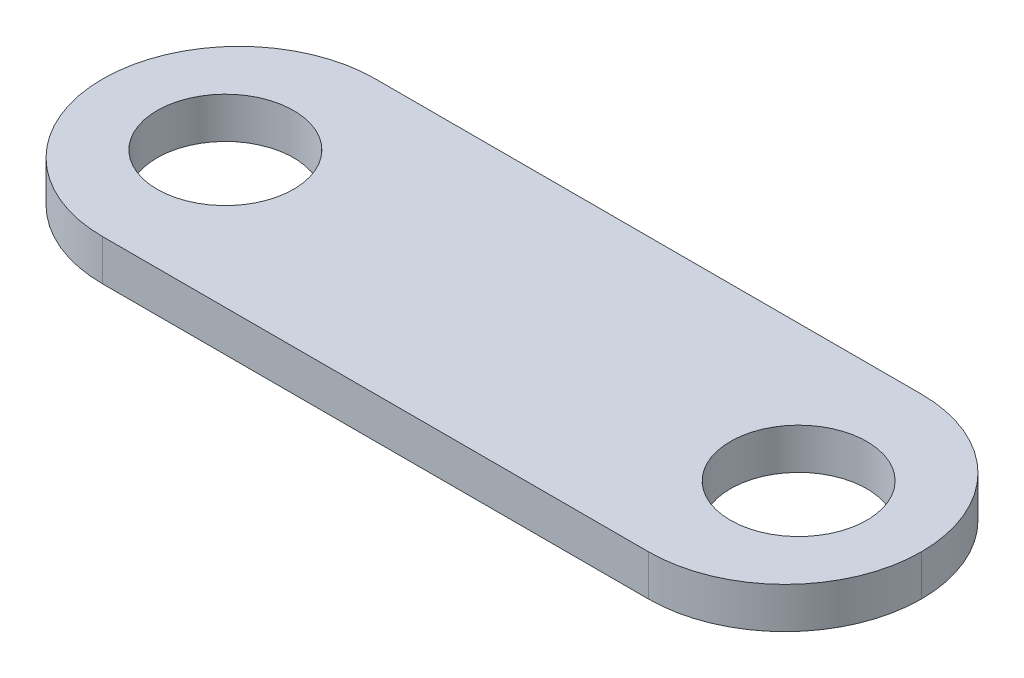
ISO-10303-21;
HEADER;
FILE_DESCRIPTION(('STEP AP214'),'2;1');
FILE_NAME('part.step','',(''),(''),'','','');
FILE_SCHEMA(('AUTOMOTIVE_DESIGN { 1 0 10303 214 1 1 1 1 }'));
ENDSEC;
DATA;
#1=APPLICATION_CONTEXT('core data for automotive mechanical design processes');
#2=APPLICATION_PROTOCOL_DEFINITION('international standard','automotive_design',2000,#1);
#3=PRODUCT_CONTEXT('',#1,'mechanical');
#4=PRODUCT('Part','Part','',(#3));
#5=PRODUCT_RELATED_PRODUCT_CATEGORY('part','',(#4));
#6=PRODUCT_DEFINITION_FORMATION('','',#4);
#7=PRODUCT_DEFINITION_CONTEXT('part definition',#1,'design');
#8=PRODUCT_DEFINITION('design','',#6,#7);
#9=PRODUCT_DEFINITION_SHAPE('','',#8);
#10=(LENGTH_UNIT() NAMED_UNIT(*) SI_UNIT(.MILLI.,.METRE.));
#11=(NAMED_UNIT(*) PLANE_ANGLE_UNIT() SI_UNIT($,.RADIAN.));
#12=(NAMED_UNIT(*) SI_UNIT($,.STERADIAN.) SOLID_ANGLE_UNIT());
#13=UNCERTAINTY_MEASURE_WITH_UNIT(LENGTH_MEASURE(1.E-05),#10,'distance_accuracy_value','');
#14=(GEOMETRIC_REPRESENTATION_CONTEXT(3) GLOBAL_UNCERTAINTY_ASSIGNED_CONTEXT((#13)) GLOBAL_UNIT_ASSIGNED_CONTEXT((#10,
#11,#12)) REPRESENTATION_CONTEXT('',''));
#15=CARTESIAN_POINT('',(0.,0.,0.));
#16=DIRECTION('',(0.,0.,1.));
#17=DIRECTION('',(1.,0.,0.));
#18=AXIS2_PLACEMENT_3D('',#15,#16,#17);
#19=CARTESIAN_POINT('',(0.,3.,0.));
#20=DIRECTION('',(0.,0.,-1.));
#21=DIRECTION('',(-1.,0.,0.));
#22=AXIS2_PLACEMENT_3D('',#19,#20,#21);
#23=PLANE('',#22);
#24=DIRECTION('',(1.,0.,0.));
#25=VECTOR('',#24,1.);
#26=CARTESIAN_POINT('',(0.,0.,0.));
#27=LINE('',#26,#25);
#28=CARTESIAN_POINT('',(10.,0.,0.));
#29=VERTEX_POINT('',#28);
#30=CARTESIAN_POINT('',(50.,0.,0.));
#31=VERTEX_POINT('',#30);
#32=EDGE_CURVE('E99',#29,#31,#27,.T.);
#33=ORIENTED_EDGE('',*,*,#32,.T.);
#34=DIRECTION('',(0.,-1.,0.));
#35=VECTOR('',#34,1.);
#36=CARTESIAN_POINT('',(50.,3.,0.));
#37=LINE('',#36,#35);
#38=CARTESIAN_POINT('',(50.,3.,0.));
#39=VERTEX_POINT('',#38);
#40=EDGE_CURVE('E11',#31,#39,#37,.F.);
#41=ORIENTED_EDGE('',*,*,#40,.T.);
#42=DIRECTION('',(1.,0.,0.));
#43=VECTOR('',#42,1.);
#44=CARTESIAN_POINT('',(0.,3.,0.));
#45=LINE('',#44,#43);
#46=CARTESIAN_POINT('',(10.,3.,0.));
#47=VERTEX_POINT('',#46);
#48=EDGE_CURVE('E141',#47,#39,#45,.T.);
#49=ORIENTED_EDGE('',*,*,#48,.F.);
#50=DIRECTION('',(0.,-1.,0.));
#51=VECTOR('',#50,1.);
#52=CARTESIAN_POINT('',(10.,3.,0.));
#53=LINE('',#52,#51);
#54=EDGE_CURVE('E123',#47,#29,#53,.T.);
#55=ORIENTED_EDGE('',*,*,#54,.T.);
#56=EDGE_LOOP('',(#33,#41,#49,#55));
#57=FACE_BOUND('',#56,.T.);
#58=ADVANCED_FACE('F37',(#57),#23,.F.);
#59=CARTESIAN_POINT('',(0.,3.,-20.));
#60=DIRECTION('',(0.,0.,1.));
#61=DIRECTION('',(1.,0.,0.));
#62=AXIS2_PLACEMENT_3D('',#59,#60,#61);
#63=PLANE('',#62);
#64=DIRECTION('',(-1.,0.,0.));
#65=VECTOR('',#64,1.);
#66=CARTESIAN_POINT('',(0.,3.,-20.));
#67=LINE('',#66,#65);
#68=CARTESIAN_POINT('',(50.,3.,-20.));
#69=VERTEX_POINT('',#68);
#70=CARTESIAN_POINT('',(10.,3.,-20.));
#71=VERTEX_POINT('',#70);
#72=EDGE_CURVE('E102',#69,#71,#67,.T.);
#73=ORIENTED_EDGE('',*,*,#72,.F.);
#74=DIRECTION('',(0.,-1.,0.));
#75=VECTOR('',#74,1.);
#76=CARTESIAN_POINT('',(50.,3.,-20.));
#77=LINE('',#76,#75);
#78=CARTESIAN_POINT('',(50.,0.,-20.));
#79=VERTEX_POINT('',#78);
#80=EDGE_CURVE('E124',#69,#79,#77,.T.);
#81=ORIENTED_EDGE('',*,*,#80,.T.);
#82=DIRECTION('',(-1.,0.,0.));
#83=VECTOR('',#82,1.);
#84=CARTESIAN_POINT('',(0.,0.,-20.));
#85=LINE('',#84,#83);
#86=CARTESIAN_POINT('',(10.,0.,-20.));
#87=VERTEX_POINT('',#86);
#88=EDGE_CURVE('E145',#79,#87,#85,.T.);
#89=ORIENTED_EDGE('',*,*,#88,.T.);
#90=DIRECTION('',(0.,-1.,0.));
#91=VECTOR('',#90,1.);
#92=CARTESIAN_POINT('',(10.,3.,-20.));
#93=LINE('',#92,#91);
#94=EDGE_CURVE('E115',#87,#71,#93,.F.);
#95=ORIENTED_EDGE('',*,*,#94,.T.);
#96=EDGE_LOOP('',(#73,#81,#89,#95));
#97=FACE_BOUND('',#96,.T.);
#98=ADVANCED_FACE('F140',(#97),#63,.F.);
#99=CARTESIAN_POINT('',(0.,3.,0.));
#100=DIRECTION('',(0.,-1.,0.));
#101=DIRECTION('',(0.,0.,-1.));
#102=AXIS2_PLACEMENT_3D('',#99,#100,#101);
#103=PLANE('',#102);
#104=CARTESIAN_POINT('',(51.,3.,-10.));
#105=DIRECTION('',(0.,1.,0.));
#106=DIRECTION('',(0.,0.,1.));
#107=AXIS2_PLACEMENT_3D('',#104,#105,#106);
#108=CIRCLE('',#107,4.99999999999999);
#109=CARTESIAN_POINT('',(51.,3.,-5.00000000000001));
#110=VERTEX_POINT('',#109);
#111=EDGE_CURVE('E111',#110,#110,#108,.T.);
#112=ORIENTED_EDGE('',*,*,#111,.F.);
#113=EDGE_LOOP('',(#112));
#114=FACE_BOUND('',#113,.T.);
#115=CARTESIAN_POINT('',(9.,3.,-10.));
#116=DIRECTION('',(0.,1.,0.));
#117=DIRECTION('',(0.,0.,1.));
#118=AXIS2_PLACEMENT_3D('',#115,#116,#117);
#119=CIRCLE('',#118,5.);
#120=CARTESIAN_POINT('',(9.,3.,-5.));
#121=VERTEX_POINT('',#120);
#122=EDGE_CURVE('E189',#121,#121,#119,.T.);
#123=ORIENTED_EDGE('',*,*,#122,.F.);
#124=EDGE_LOOP('',(#123));
#125=FACE_BOUND('',#124,.T.);
#126=CARTESIAN_POINT('',(50.,3.,-10.));
#127=DIRECTION('',(0.,-1.,0.));
#128=DIRECTION('',(0.,0.,-1.));
#129=AXIS2_PLACEMENT_3D('',#126,#127,#128);
#130=CIRCLE('',#129,10.);
#131=CARTESIAN_POINT('',(60.,3.,-10.));
#132=VERTEX_POINT('',#131);
#133=EDGE_CURVE('E53',#39,#132,#130,.F.);
#134=ORIENTED_EDGE('',*,*,#133,.T.);
#135=CARTESIAN_POINT('',(50.,3.,-10.));
#136=DIRECTION('',(0.,-1.,0.));
#137=DIRECTION('',(0.,0.,-1.));
#138=AXIS2_PLACEMENT_3D('',#135,#136,#137);
#139=CIRCLE('',#138,10.);
#140=EDGE_CURVE('E46',#132,#69,#139,.F.);
#141=ORIENTED_EDGE('',*,*,#140,.T.);
#142=ORIENTED_EDGE('',*,*,#72,.T.);
#143=CARTESIAN_POINT('',(10.,3.,-10.));
#144=DIRECTION('',(0.,-1.,0.));
#145=DIRECTION('',(0.,0.,-1.));
#146=AXIS2_PLACEMENT_3D('',#143,#144,#145);
#147=CIRCLE('',#146,10.);
#148=CARTESIAN_POINT('',(0.,3.,-10.));
#149=VERTEX_POINT('',#148);
#150=EDGE_CURVE('E121',#71,#149,#147,.F.);
#151=ORIENTED_EDGE('',*,*,#150,.T.);
#152=CARTESIAN_POINT('',(10.,3.,-10.));
#153=DIRECTION('',(0.,-1.,0.));
#154=DIRECTION('',(0.,0.,-1.));
#155=AXIS2_PLACEMENT_3D('',#152,#153,#154);
#156=CIRCLE('',#155,10.);
#157=EDGE_CURVE('E108',#149,#47,#156,.F.);
#158=ORIENTED_EDGE('',*,*,#157,.T.);
#159=ORIENTED_EDGE('',*,*,#48,.T.);
#160=EDGE_LOOP('',(#134,#141,#142,#151,#158,#159));
#161=FACE_BOUND('',#160,.T.);
#162=ADVANCED_FACE('F135',(#114,#125,#161),#103,.F.);
#163=CARTESIAN_POINT('',(0.,0.,0.));
#164=DIRECTION('',(0.,-1.,0.));
#165=DIRECTION('',(0.,0.,-1.));
#166=AXIS2_PLACEMENT_3D('',#163,#164,#165);
#167=PLANE('',#166);
#168=CARTESIAN_POINT('',(51.,0.,-10.));
#169=DIRECTION('',(0.,1.,0.));
#170=DIRECTION('',(0.,0.,1.));
#171=AXIS2_PLACEMENT_3D('',#168,#169,#170);
#172=CIRCLE('',#171,4.99999999999999);
#173=CARTESIAN_POINT('',(51.,0.,-5.00000000000001));
#174=VERTEX_POINT('',#173);
#175=EDGE_CURVE('E185',#174,#174,#172,.T.);
#176=ORIENTED_EDGE('',*,*,#175,.T.);
#177=EDGE_LOOP('',(#176));
#178=FACE_BOUND('',#177,.T.);
#179=CARTESIAN_POINT('',(9.,0.,-10.));
#180=DIRECTION('',(0.,1.,0.));
#181=DIRECTION('',(0.,0.,1.));
#182=AXIS2_PLACEMENT_3D('',#179,#180,#181);
#183=CIRCLE('',#182,5.);
#184=CARTESIAN_POINT('',(9.,0.,-5.));
#185=VERTEX_POINT('',#184);
#186=EDGE_CURVE('E188',#185,#185,#183,.T.);
#187=ORIENTED_EDGE('',*,*,#186,.T.);
#188=EDGE_LOOP('',(#187));
#189=FACE_BOUND('',#188,.T.);
#190=ORIENTED_EDGE('',*,*,#88,.F.);
#191=CARTESIAN_POINT('',(50.,0.,-10.));
#192=DIRECTION('',(0.,-1.,0.));
#193=DIRECTION('',(0.,0.,-1.));
#194=AXIS2_PLACEMENT_3D('',#191,#192,#193);
#195=CIRCLE('',#194,10.);
#196=CARTESIAN_POINT('',(60.,0.,-10.));
#197=VERTEX_POINT('',#196);
#198=EDGE_CURVE('E130',#79,#197,#195,.T.);
#199=ORIENTED_EDGE('',*,*,#198,.T.);
#200=CARTESIAN_POINT('',(50.,0.,-10.));
#201=DIRECTION('',(0.,-1.,0.));
#202=DIRECTION('',(0.,0.,-1.));
#203=AXIS2_PLACEMENT_3D('',#200,#201,#202);
#204=CIRCLE('',#203,10.);
#205=EDGE_CURVE('E128',#197,#31,#204,.T.);
#206=ORIENTED_EDGE('',*,*,#205,.T.);
#207=ORIENTED_EDGE('',*,*,#32,.F.);
#208=CARTESIAN_POINT('',(10.,0.,-10.));
#209=DIRECTION('',(0.,-1.,0.));
#210=DIRECTION('',(0.,0.,-1.));
#211=AXIS2_PLACEMENT_3D('',#208,#209,#210);
#212=CIRCLE('',#211,10.);
#213=CARTESIAN_POINT('',(0.,0.,-10.));
#214=VERTEX_POINT('',#213);
#215=EDGE_CURVE('E92',#29,#214,#212,.T.);
#216=ORIENTED_EDGE('',*,*,#215,.T.);
#217=CARTESIAN_POINT('',(10.,0.,-10.));
#218=DIRECTION('',(0.,-1.,0.));
#219=DIRECTION('',(0.,0.,-1.));
#220=AXIS2_PLACEMENT_3D('',#217,#218,#219);
#221=CIRCLE('',#220,10.);
#222=EDGE_CURVE('E97',#214,#87,#221,.T.);
#223=ORIENTED_EDGE('',*,*,#222,.T.);
#224=EDGE_LOOP('',(#190,#199,#206,#207,#216,#223));
#225=FACE_BOUND('',#224,.T.);
#226=ADVANCED_FACE('F95',(#178,#189,#225),#167,.T.);
#227=CARTESIAN_POINT('',(9.,0.,-10.));
#228=DIRECTION('',(0.,1.,0.));
#229=DIRECTION('',(0.,0.,1.));
#230=AXIS2_PLACEMENT_3D('',#227,#228,#229);
#231=CYLINDRICAL_SURFACE('',#230,5.);
#232=ORIENTED_EDGE('',*,*,#186,.F.);
#233=EDGE_LOOP('',(#232));
#234=FACE_BOUND('',#233,.T.);
#235=ORIENTED_EDGE('',*,*,#122,.T.);
#236=EDGE_LOOP('',(#235));
#237=FACE_BOUND('',#236,.T.);
#238=ADVANCED_FACE('F166',(#234,#237),#231,.F.);
#239=CARTESIAN_POINT('',(51.,0.,-10.));
#240=DIRECTION('',(0.,1.,0.));
#241=DIRECTION('',(0.,0.,1.));
#242=AXIS2_PLACEMENT_3D('',#239,#240,#241);
#243=CYLINDRICAL_SURFACE('',#242,4.99999999999999);
#244=ORIENTED_EDGE('',*,*,#175,.F.);
#245=EDGE_LOOP('',(#244));
#246=FACE_BOUND('',#245,.T.);
#247=ORIENTED_EDGE('',*,*,#111,.T.);
#248=EDGE_LOOP('',(#247));
#249=FACE_BOUND('',#248,.T.);
#250=ADVANCED_FACE('F162',(#246,#249),#243,.F.);
#251=CARTESIAN_POINT('',(10.,3.,-10.));
#252=DIRECTION('',(0.,-1.,0.));
#253=DIRECTION('',(0.,0.,-1.));
#254=AXIS2_PLACEMENT_3D('',#251,#252,#253);
#255=CYLINDRICAL_SURFACE('',#254,10.);
#256=ORIENTED_EDGE('',*,*,#54,.F.);
#257=ORIENTED_EDGE('',*,*,#157,.F.);
#258=DIRECTION('',(0.,-1.,0.));
#259=VECTOR('',#258,1.);
#260=CARTESIAN_POINT('',(0.,3.,-10.));
#261=LINE('',#260,#259);
#262=EDGE_CURVE('E106',#214,#149,#261,.F.);
#263=ORIENTED_EDGE('',*,*,#262,.F.);
#264=ORIENTED_EDGE('',*,*,#215,.F.);
#265=EDGE_LOOP('',(#256,#257,#263,#264));
#266=FACE_BOUND('',#265,.T.);
#267=ADVANCED_FACE('F107',(#266),#255,.T.);
#268=CARTESIAN_POINT('',(10.,3.,-10.));
#269=DIRECTION('',(0.,-1.,0.));
#270=DIRECTION('',(0.,0.,-1.));
#271=AXIS2_PLACEMENT_3D('',#268,#269,#270);
#272=CYLINDRICAL_SURFACE('',#271,10.);
#273=ORIENTED_EDGE('',*,*,#150,.F.);
#274=ORIENTED_EDGE('',*,*,#94,.F.);
#275=ORIENTED_EDGE('',*,*,#222,.F.);
#276=ORIENTED_EDGE('',*,*,#262,.T.);
#277=EDGE_LOOP('',(#273,#274,#275,#276));
#278=FACE_BOUND('',#277,.T.);
#279=ADVANCED_FACE('F113',(#278),#272,.T.);
#280=CARTESIAN_POINT('',(50.,3.,-10.));
#281=DIRECTION('',(0.,-1.,0.));
#282=DIRECTION('',(0.,0.,-1.));
#283=AXIS2_PLACEMENT_3D('',#280,#281,#282);
#284=CYLINDRICAL_SURFACE('',#283,10.);
#285=DIRECTION('',(0.,-1.,0.));
#286=VECTOR('',#285,1.);
#287=CARTESIAN_POINT('',(60.,3.,-10.));
#288=LINE('',#287,#286);
#289=EDGE_CURVE('E41',#132,#197,#288,.T.);
#290=ORIENTED_EDGE('',*,*,#289,.F.);
#291=ORIENTED_EDGE('',*,*,#133,.F.);
#292=ORIENTED_EDGE('',*,*,#40,.F.);
#293=ORIENTED_EDGE('',*,*,#205,.F.);
#294=EDGE_LOOP('',(#290,#291,#292,#293));
#295=FACE_BOUND('',#294,.T.);
#296=ADVANCED_FACE('F39',(#295),#284,.T.);
#297=CARTESIAN_POINT('',(50.,3.,-10.));
#298=DIRECTION('',(0.,-1.,0.));
#299=DIRECTION('',(0.,0.,-1.));
#300=AXIS2_PLACEMENT_3D('',#297,#298,#299);
#301=CYLINDRICAL_SURFACE('',#300,10.);
#302=ORIENTED_EDGE('',*,*,#140,.F.);
#303=ORIENTED_EDGE('',*,*,#289,.T.);
#304=ORIENTED_EDGE('',*,*,#198,.F.);
#305=ORIENTED_EDGE('',*,*,#80,.F.);
#306=EDGE_LOOP('',(#302,#303,#304,#305));
#307=FACE_BOUND('',#306,.T.);
#308=ADVANCED_FACE('F143',(#307),#301,.T.);
#309=CLOSED_SHELL('',(#58,#98,#162,#226,#238,#250,#267,#279,#296,#308));
#310=MANIFOLD_SOLID_BREP('B2',#309);
#311=ADVANCED_BREP_SHAPE_REPRESENTATION('',(#18,#310),#14);
#312=SHAPE_DEFINITION_REPRESENTATION(#9,#311);
ENDSEC;
END-ISO-10303-21;
